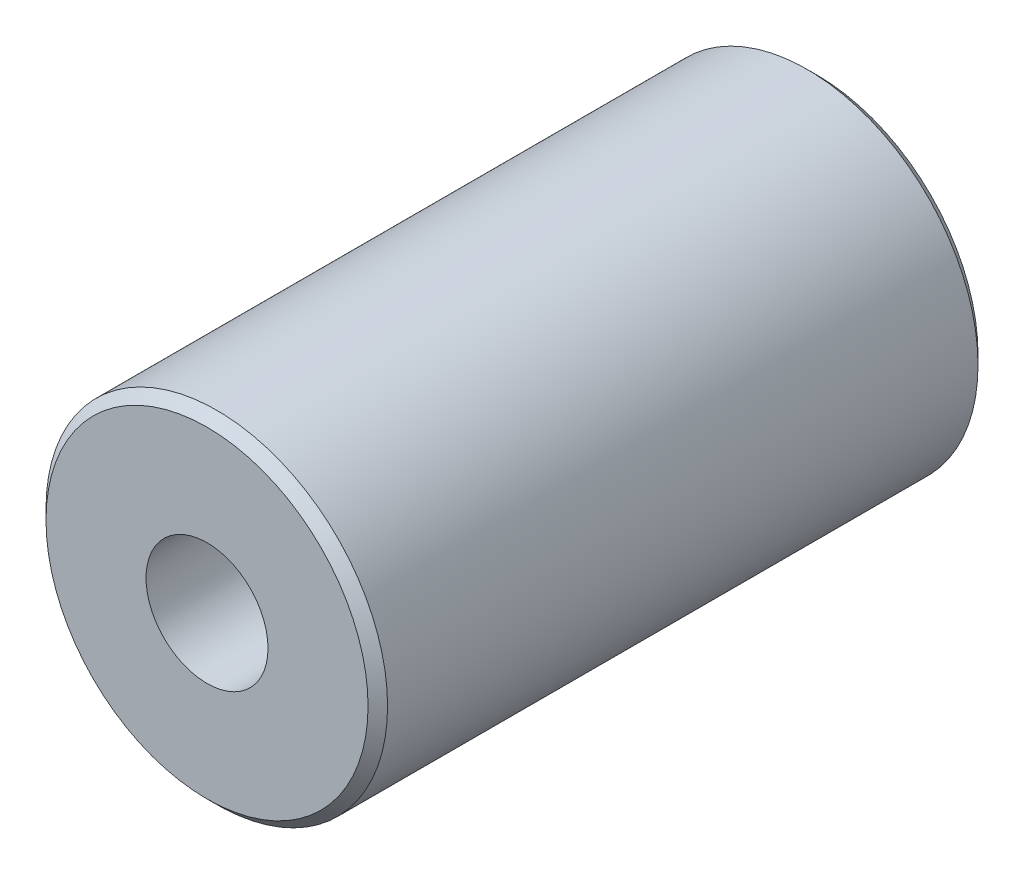
ISO-10303-21;
HEADER;
FILE_DESCRIPTION(('STEP AP214'),'2;1');
FILE_NAME('part.step','',(''),(''),'','','');
FILE_SCHEMA(('AUTOMOTIVE_DESIGN { 1 0 10303 214 1 1 1 1 }'));
ENDSEC;
DATA;
#1=APPLICATION_CONTEXT('core data for automotive mechanical design processes');
#2=APPLICATION_PROTOCOL_DEFINITION('international standard','automotive_design',2000,#1);
#3=PRODUCT_CONTEXT('',#1,'mechanical');
#4=PRODUCT('Part','Part','',(#3));
#5=PRODUCT_RELATED_PRODUCT_CATEGORY('part','',(#4));
#6=PRODUCT_DEFINITION_FORMATION('','',#4);
#7=PRODUCT_DEFINITION_CONTEXT('part definition',#1,'design');
#8=PRODUCT_DEFINITION('design','',#6,#7);
#9=PRODUCT_DEFINITION_SHAPE('','',#8);
#10=(LENGTH_UNIT() NAMED_UNIT(*) SI_UNIT(.MILLI.,.METRE.));
#11=(NAMED_UNIT(*) PLANE_ANGLE_UNIT() SI_UNIT($,.RADIAN.));
#12=(NAMED_UNIT(*) SI_UNIT($,.STERADIAN.) SOLID_ANGLE_UNIT());
#13=UNCERTAINTY_MEASURE_WITH_UNIT(LENGTH_MEASURE(1.E-05),#10,'distance_accuracy_value','');
#14=(GEOMETRIC_REPRESENTATION_CONTEXT(3) GLOBAL_UNCERTAINTY_ASSIGNED_CONTEXT((#13)) GLOBAL_UNIT_ASSIGNED_CONTEXT((#10,
#11,#12)) REPRESENTATION_CONTEXT('',''));
#15=CARTESIAN_POINT('',(0.,0.,0.));
#16=DIRECTION('',(0.,0.,1.));
#17=DIRECTION('',(1.,0.,0.));
#18=AXIS2_PLACEMENT_3D('',#15,#16,#17);
#19=CARTESIAN_POINT('',(0.,0.,12.5));
#20=DIRECTION('',(0.,0.,-1.));
#21=DIRECTION('',(-1.,0.,0.));
#22=AXIS2_PLACEMENT_3D('',#19,#20,#21);
#23=CYLINDRICAL_SURFACE('',#22,7.);
#24=CARTESIAN_POINT('',(0.,0.,12.1));
#25=DIRECTION('',(0.,0.,1.));
#26=DIRECTION('',(1.,0.,0.));
#27=AXIS2_PLACEMENT_3D('',#24,#25,#26);
#28=CIRCLE('',#27,7.);
#29=CARTESIAN_POINT('',(7.,0.,12.1));
#30=VERTEX_POINT('',#29);
#31=EDGE_CURVE('E45',#30,#30,#28,.F.);
#32=ORIENTED_EDGE('',*,*,#31,.T.);
#33=EDGE_LOOP('',(#32));
#34=FACE_BOUND('',#33,.T.);
#35=CARTESIAN_POINT('',(0.,0.,-12.1));
#36=DIRECTION('',(0.,0.,1.));
#37=DIRECTION('',(1.,0.,0.));
#38=AXIS2_PLACEMENT_3D('',#35,#36,#37);
#39=CIRCLE('',#38,7.);
#40=CARTESIAN_POINT('',(7.,0.,-12.1));
#41=VERTEX_POINT('',#40);
#42=EDGE_CURVE('E49',#41,#41,#39,.T.);
#43=ORIENTED_EDGE('',*,*,#42,.T.);
#44=EDGE_LOOP('',(#43));
#45=FACE_BOUND('',#44,.T.);
#46=ADVANCED_FACE('F37',(#34,#45),#23,.T.);
#47=CARTESIAN_POINT('',(0.,0.,12.5));
#48=DIRECTION('',(0.,0.,1.));
#49=DIRECTION('',(1.,0.,0.));
#50=AXIS2_PLACEMENT_3D('',#47,#48,#49);
#51=PLANE('',#50);
#52=CARTESIAN_POINT('',(0.,0.,12.5));
#53=DIRECTION('',(0.,0.,1.));
#54=DIRECTION('',(1.,0.,0.));
#55=AXIS2_PLACEMENT_3D('',#52,#53,#54);
#56=CIRCLE('',#55,6.59999999999999);
#57=CARTESIAN_POINT('',(6.59999999999999,0.,12.5));
#58=VERTEX_POINT('',#57);
#59=EDGE_CURVE('E53',#58,#58,#56,.T.);
#60=ORIENTED_EDGE('',*,*,#59,.T.);
#61=EDGE_LOOP('',(#60));
#62=FACE_BOUND('',#61,.T.);
#63=CARTESIAN_POINT('',(0.,0.,12.5));
#64=DIRECTION('',(0.,0.,1.));
#65=DIRECTION('',(1.,0.,0.));
#66=AXIS2_PLACEMENT_3D('',#63,#64,#65);
#67=CIRCLE('',#66,2.5);
#68=CARTESIAN_POINT('',(2.5,0.,12.5));
#69=VERTEX_POINT('',#68);
#70=EDGE_CURVE('E58',#69,#69,#67,.T.);
#71=ORIENTED_EDGE('',*,*,#70,.F.);
#72=EDGE_LOOP('',(#71));
#73=FACE_BOUND('',#72,.T.);
#74=ADVANCED_FACE('F92',(#62,#73),#51,.T.);
#75=CARTESIAN_POINT('',(0.,0.,-12.5));
#76=DIRECTION('',(0.,0.,1.));
#77=DIRECTION('',(1.,0.,0.));
#78=AXIS2_PLACEMENT_3D('',#75,#76,#77);
#79=PLANE('',#78);
#80=CARTESIAN_POINT('',(0.,0.,-12.5));
#81=DIRECTION('',(0.,0.,1.));
#82=DIRECTION('',(1.,0.,0.));
#83=AXIS2_PLACEMENT_3D('',#80,#81,#82);
#84=CIRCLE('',#83,6.59999999999999);
#85=CARTESIAN_POINT('',(6.59999999999999,0.,-12.5));
#86=VERTEX_POINT('',#85);
#87=EDGE_CURVE('E10',#86,#86,#84,.F.);
#88=ORIENTED_EDGE('',*,*,#87,.T.);
#89=EDGE_LOOP('',(#88));
#90=FACE_BOUND('',#89,.T.);
#91=CARTESIAN_POINT('',(0.,0.,-12.5));
#92=DIRECTION('',(0.,0.,1.));
#93=DIRECTION('',(1.,0.,0.));
#94=AXIS2_PLACEMENT_3D('',#91,#92,#93);
#95=CIRCLE('',#94,4.);
#96=CARTESIAN_POINT('',(4.,0.,-12.5));
#97=VERTEX_POINT('',#96);
#98=EDGE_CURVE('E62',#97,#97,#95,.T.);
#99=ORIENTED_EDGE('',*,*,#98,.T.);
#100=EDGE_LOOP('',(#99));
#101=FACE_BOUND('',#100,.T.);
#102=ADVANCED_FACE('F71',(#90,#101),#79,.F.);
#103=CARTESIAN_POINT('',(0.,0.,-12.5));
#104=DIRECTION('',(0.,0.,1.));
#105=DIRECTION('',(1.,0.,0.));
#106=AXIS2_PLACEMENT_3D('',#103,#104,#105);
#107=CYLINDRICAL_SURFACE('',#106,2.5);
#108=CARTESIAN_POINT('',(0.,0.,0.));
#109=DIRECTION('',(0.,0.,1.));
#110=DIRECTION('',(1.,0.,0.));
#111=AXIS2_PLACEMENT_3D('',#108,#109,#110);
#112=CIRCLE('',#111,2.5);
#113=CARTESIAN_POINT('',(2.5,0.,0.));
#114=VERTEX_POINT('',#113);
#115=EDGE_CURVE('E59',#114,#114,#112,.F.);
#116=ORIENTED_EDGE('',*,*,#115,.T.);
#117=EDGE_LOOP('',(#116));
#118=FACE_BOUND('',#117,.T.);
#119=ORIENTED_EDGE('',*,*,#70,.T.);
#120=EDGE_LOOP('',(#119));
#121=FACE_BOUND('',#120,.T.);
#122=ADVANCED_FACE('F83',(#118,#121),#107,.F.);
#123=CARTESIAN_POINT('',(0.,0.,0.));
#124=DIRECTION('',(0.,0.,1.));
#125=DIRECTION('',(1.,0.,0.));
#126=AXIS2_PLACEMENT_3D('',#123,#124,#125);
#127=PLANE('',#126);
#128=CARTESIAN_POINT('',(0.,0.,0.));
#129=DIRECTION('',(0.,0.,1.));
#130=DIRECTION('',(1.,0.,0.));
#131=AXIS2_PLACEMENT_3D('',#128,#129,#130);
#132=CIRCLE('',#131,4.);
#133=CARTESIAN_POINT('',(4.,0.,0.));
#134=VERTEX_POINT('',#133);
#135=EDGE_CURVE('E65',#134,#134,#132,.T.);
#136=ORIENTED_EDGE('',*,*,#135,.F.);
#137=EDGE_LOOP('',(#136));
#138=FACE_BOUND('',#137,.T.);
#139=ORIENTED_EDGE('',*,*,#115,.F.);
#140=EDGE_LOOP('',(#139));
#141=FACE_BOUND('',#140,.T.);
#142=ADVANCED_FACE('F77',(#138,#141),#127,.F.);
#143=CARTESIAN_POINT('',(0.,0.,-12.5));
#144=DIRECTION('',(0.,0.,1.));
#145=DIRECTION('',(1.,0.,0.));
#146=AXIS2_PLACEMENT_3D('',#143,#144,#145);
#147=CYLINDRICAL_SURFACE('',#146,4.);
#148=ORIENTED_EDGE('',*,*,#98,.F.);
#149=EDGE_LOOP('',(#148));
#150=FACE_BOUND('',#149,.T.);
#151=ORIENTED_EDGE('',*,*,#135,.T.);
#152=EDGE_LOOP('',(#151));
#153=FACE_BOUND('',#152,.T.);
#154=ADVANCED_FACE('F73',(#150,#153),#147,.F.);
#155=CARTESIAN_POINT('',(0.,0.,12.5));
#156=DIRECTION('',(0.,0.,-1.));
#157=DIRECTION('',(-1.,0.,0.));
#158=AXIS2_PLACEMENT_3D('',#155,#156,#157);
#159=CONICAL_SURFACE('',#158,6.59999999999999,0.785398163397439);
#160=ORIENTED_EDGE('',*,*,#31,.F.);
#161=EDGE_LOOP('',(#160));
#162=FACE_BOUND('',#161,.T.);
#163=ORIENTED_EDGE('',*,*,#59,.F.);
#164=EDGE_LOOP('',(#163));
#165=FACE_BOUND('',#164,.T.);
#166=ADVANCED_FACE('F76',(#162,#165),#159,.T.);
#167=CARTESIAN_POINT('',(0.,0.,-12.1));
#168=DIRECTION('',(0.,0.,1.));
#169=DIRECTION('',(1.,0.,0.));
#170=AXIS2_PLACEMENT_3D('',#167,#168,#169);
#171=CONICAL_SURFACE('',#170,7.,0.785398163397449);
#172=ORIENTED_EDGE('',*,*,#87,.F.);
#173=EDGE_LOOP('',(#172));
#174=FACE_BOUND('',#173,.T.);
#175=ORIENTED_EDGE('',*,*,#42,.F.);
#176=EDGE_LOOP('',(#175));
#177=FACE_BOUND('',#176,.T.);
#178=ADVANCED_FACE('F40',(#174,#177),#171,.T.);
#179=CLOSED_SHELL('',(#46,#74,#102,#122,#142,#154,#166,#178));
#180=MANIFOLD_SOLID_BREP('B2',#179);
#181=ADVANCED_BREP_SHAPE_REPRESENTATION('',(#18,#180),#14);
#182=SHAPE_DEFINITION_REPRESENTATION(#9,#181);
ENDSEC;
END-ISO-10303-21;
